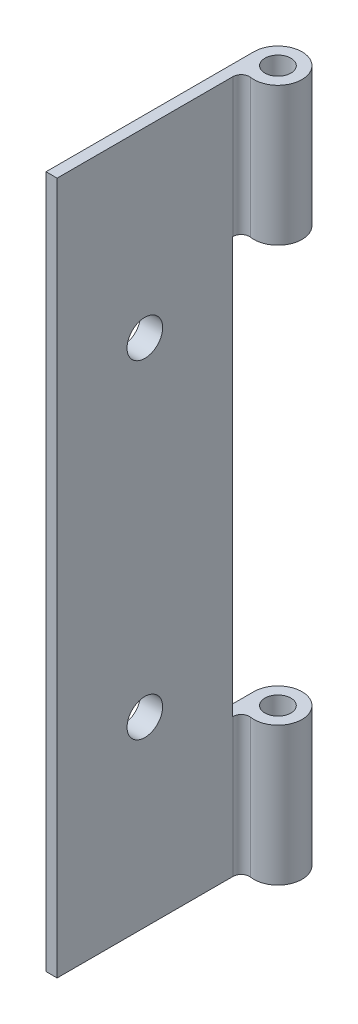
ISO-10303-21;
HEADER;
FILE_DESCRIPTION(('STEP AP214'),'2;1');
FILE_NAME('part.step','',(''),(''),'','','');
FILE_SCHEMA(('AUTOMOTIVE_DESIGN { 1 0 10303 214 1 1 1 1 }'));
ENDSEC;
DATA;
#1=APPLICATION_CONTEXT('core data for automotive mechanical design processes');
#2=APPLICATION_PROTOCOL_DEFINITION('international standard','automotive_design',2000,#1);
#3=PRODUCT_CONTEXT('',#1,'mechanical');
#4=PRODUCT('Part','Part','',(#3));
#5=PRODUCT_RELATED_PRODUCT_CATEGORY('part','',(#4));
#6=PRODUCT_DEFINITION_FORMATION('','',#4);
#7=PRODUCT_DEFINITION_CONTEXT('part definition',#1,'design');
#8=PRODUCT_DEFINITION('design','',#6,#7);
#9=PRODUCT_DEFINITION_SHAPE('','',#8);
#10=(LENGTH_UNIT() NAMED_UNIT(*) SI_UNIT(.MILLI.,.METRE.));
#11=(NAMED_UNIT(*) PLANE_ANGLE_UNIT() SI_UNIT($,.RADIAN.));
#12=(NAMED_UNIT(*) SI_UNIT($,.STERADIAN.) SOLID_ANGLE_UNIT());
#13=UNCERTAINTY_MEASURE_WITH_UNIT(LENGTH_MEASURE(1.E-05),#10,'distance_accuracy_value','');
#14=(GEOMETRIC_REPRESENTATION_CONTEXT(3) GLOBAL_UNCERTAINTY_ASSIGNED_CONTEXT((#13)) GLOBAL_UNIT_ASSIGNED_CONTEXT((#10,
#11,#12)) REPRESENTATION_CONTEXT('',''));
#15=CARTESIAN_POINT('',(0.,0.,0.));
#16=DIRECTION('',(0.,0.,1.));
#17=DIRECTION('',(1.,0.,0.));
#18=AXIS2_PLACEMENT_3D('',#15,#16,#17);
#19=CARTESIAN_POINT('',(-0.445,50.355,15.968625));
#20=DIRECTION('',(0.,0.,-1.));
#21=DIRECTION('',(0.,1.,0.));
#22=AXIS2_PLACEMENT_3D('',#19,#20,#21);
#23=CYLINDRICAL_SURFACE('',#22,0.444999999999999);
#24=CARTESIAN_POINT('',(-0.445,50.355,15.968625));
#25=DIRECTION('',(0.,0.,-1.));
#26=DIRECTION('',(0.,1.,0.));
#27=AXIS2_PLACEMENT_3D('',#24,#25,#26);
#28=CIRCLE('',#27,0.444999999999999);
#29=CARTESIAN_POINT('',(-0.445,50.8,15.968625));
#30=VERTEX_POINT('',#29);
#31=EDGE_CURVE('E11',#30,#30,#28,.T.);
#32=ORIENTED_EDGE('',*,*,#31,.T.);
#33=EDGE_LOOP('',(#32));
#34=FACE_BOUND('',#33,.T.);
#35=CARTESIAN_POINT('',(-0.445,50.355,2.968625));
#36=DIRECTION('',(0.,0.,-1.));
#37=DIRECTION('',(0.,1.,0.));
#38=AXIS2_PLACEMENT_3D('',#35,#36,#37);
#39=CIRCLE('',#38,0.444999999999999);
#40=CARTESIAN_POINT('',(-0.445,50.8,2.968625));
#41=VERTEX_POINT('',#40);
#42=EDGE_CURVE('E57',#41,#41,#39,.T.);
#43=ORIENTED_EDGE('',*,*,#42,.F.);
#44=EDGE_LOOP('',(#43));
#45=FACE_BOUND('',#44,.T.);
#46=ADVANCED_FACE('F54',(#34,#45),#23,.T.);
#47=CARTESIAN_POINT('',(-0.445,50.355,15.968625));
#48=DIRECTION('',(0.,0.,-1.));
#49=DIRECTION('',(0.,1.,0.));
#50=AXIS2_PLACEMENT_3D('',#47,#48,#49);
#51=PLANE('',#50);
#52=ORIENTED_EDGE('',*,*,#31,.F.);
#53=EDGE_LOOP('',(#52));
#54=FACE_BOUND('',#53,.T.);
#55=ADVANCED_FACE('F69',(#54),#51,.F.);
#56=CARTESIAN_POINT('',(-0.445,50.355,2.968625));
#57=DIRECTION('',(0.,0.,-1.));
#58=DIRECTION('',(0.,1.,0.));
#59=AXIS2_PLACEMENT_3D('',#56,#57,#58);
#60=PLANE('',#59);
#61=ORIENTED_EDGE('',*,*,#42,.T.);
#62=EDGE_LOOP('',(#61));
#63=FACE_BOUND('',#62,.T.);
#64=ADVANCED_FACE('F66',(#63),#60,.T.);
#65=CLOSED_SHELL('',(#46,#55,#64));
#66=MANIFOLD_SOLID_BREP('B2',#65);
#67=CARTESIAN_POINT('',(0.,88.9,0.));
#68=DIRECTION('',(1.,0.,0.));
#69=DIRECTION('',(0.,0.,-1.));
#70=AXIS2_PLACEMENT_3D('',#67,#68,#69);
#71=PLANE('',#70);
#72=DIRECTION('',(0.,-1.,0.));
#73=VECTOR('',#72,1.);
#74=CARTESIAN_POINT('',(0.,63.5,2.968625));
#75=LINE('',#74,#73);
#76=CARTESIAN_POINT('',(0.,63.5,2.968625));
#77=VERTEX_POINT('',#76);
#78=CARTESIAN_POINT('',(0.,25.4,2.968625));
#79=VERTEX_POINT('',#78);
#80=EDGE_CURVE('E387',#77,#79,#75,.T.);
#81=ORIENTED_EDGE('',*,*,#80,.T.);
#82=DIRECTION('',(0.,0.,-1.));
#83=VECTOR('',#82,1.);
#84=CARTESIAN_POINT('',(0.,25.4,2.968625));
#85=LINE('',#84,#83);
#86=CARTESIAN_POINT('',(0.,25.4,0.));
#87=VERTEX_POINT('',#86);
#88=EDGE_CURVE('E394',#79,#87,#85,.T.);
#89=ORIENTED_EDGE('',*,*,#88,.T.);
#90=DIRECTION('',(0.,-1.,0.));
#91=VECTOR('',#90,1.);
#92=CARTESIAN_POINT('',(0.,88.9,0.));
#93=LINE('',#92,#91);
#94=CARTESIAN_POINT('',(0.,12.7,0.));
#95=VERTEX_POINT('',#94);
#96=EDGE_CURVE('E324',#87,#95,#93,.T.);
#97=ORIENTED_EDGE('',*,*,#96,.T.);
#98=DIRECTION('',(0.,0.,1.));
#99=VECTOR('',#98,1.);
#100=CARTESIAN_POINT('',(0.,12.7,2.968625));
#101=LINE('',#100,#99);
#102=CARTESIAN_POINT('',(0.,12.7,19.05));
#103=VERTEX_POINT('',#102);
#104=EDGE_CURVE('E377',#95,#103,#101,.T.);
#105=ORIENTED_EDGE('',*,*,#104,.T.);
#106=DIRECTION('',(0.,-1.,0.));
#107=VECTOR('',#106,1.);
#108=CARTESIAN_POINT('',(0.,88.9,19.05));
#109=LINE('',#108,#107);
#110=CARTESIAN_POINT('',(0.,76.2,19.05));
#111=VERTEX_POINT('',#110);
#112=EDGE_CURVE('E328',#111,#103,#109,.T.);
#113=ORIENTED_EDGE('',*,*,#112,.F.);
#114=DIRECTION('',(0.,0.,-1.));
#115=VECTOR('',#114,1.);
#116=CARTESIAN_POINT('',(0.,76.2,2.968625));
#117=LINE('',#116,#115);
#118=CARTESIAN_POINT('',(0.,76.2,0.));
#119=VERTEX_POINT('',#118);
#120=EDGE_CURVE('E398',#111,#119,#117,.T.);
#121=ORIENTED_EDGE('',*,*,#120,.T.);
#122=CARTESIAN_POINT('',(0.,63.5,0.));
#123=VERTEX_POINT('',#122);
#124=EDGE_CURVE('E320',#119,#123,#93,.T.);
#125=ORIENTED_EDGE('',*,*,#124,.T.);
#126=DIRECTION('',(0.,0.,1.));
#127=VECTOR('',#126,1.);
#128=CARTESIAN_POINT('',(0.,63.5,2.968625));
#129=LINE('',#128,#127);
#130=EDGE_CURVE('E383',#123,#77,#129,.T.);
#131=ORIENTED_EDGE('',*,*,#130,.T.);
#132=EDGE_LOOP('',(#81,#89,#97,#105,#113,#121,#125,#131));
#133=FACE_BOUND('',#132,.T.);
#134=DIRECTION('',(0.,-1.,0.));
#135=VECTOR('',#134,1.);
#136=CARTESIAN_POINT('',(0.,63.5,6.008625));
#137=LINE('',#136,#135);
#138=CARTESIAN_POINT('',(0.,54.5,6.008625));
#139=VERTEX_POINT('',#138);
#140=CARTESIAN_POINT('',(0.,64.5,6.008625));
#141=VERTEX_POINT('',#140);
#142=EDGE_CURVE('E246',#139,#141,#137,.F.);
#143=ORIENTED_EDGE('',*,*,#142,.T.);
#144=DIRECTION('',(0.,0.,-1.));
#145=VECTOR('',#144,1.);
#146=CARTESIAN_POINT('',(0.,64.5,15.008625));
#147=LINE('',#146,#145);
#148=CARTESIAN_POINT('',(0.,64.5,16.008625));
#149=VERTEX_POINT('',#148);
#150=EDGE_CURVE('E278',#141,#149,#147,.F.);
#151=ORIENTED_EDGE('',*,*,#150,.T.);
#152=DIRECTION('',(0.,1.,0.));
#153=VECTOR('',#152,1.);
#154=CARTESIAN_POINT('',(0.,55.5,16.008625));
#155=LINE('',#154,#153);
#156=CARTESIAN_POINT('',(0.,54.5,16.008625));
#157=VERTEX_POINT('',#156);
#158=EDGE_CURVE('E301',#149,#157,#155,.F.);
#159=ORIENTED_EDGE('',*,*,#158,.T.);
#160=DIRECTION('',(0.,0.,1.));
#161=VECTOR('',#160,1.);
#162=CARTESIAN_POINT('',(0.,54.5,7.008625));
#163=LINE('',#162,#161);
#164=EDGE_CURVE('E298',#157,#139,#163,.F.);
#165=ORIENTED_EDGE('',*,*,#164,.T.);
#166=EDGE_LOOP('',(#143,#151,#159,#165));
#167=FACE_BOUND('',#166,.T.);
#168=DIRECTION('',(0.,1.,0.));
#169=VECTOR('',#168,1.);
#170=CARTESIAN_POINT('',(0.,25.4,16.008625));
#171=LINE('',#170,#169);
#172=CARTESIAN_POINT('',(0.,34.4,16.008625));
#173=VERTEX_POINT('',#172);
#174=CARTESIAN_POINT('',(0.,24.4,16.008625));
#175=VERTEX_POINT('',#174);
#176=EDGE_CURVE('E308',#173,#175,#171,.F.);
#177=ORIENTED_EDGE('',*,*,#176,.T.);
#178=DIRECTION('',(0.,0.,1.));
#179=VECTOR('',#178,1.);
#180=CARTESIAN_POINT('',(0.,24.4,7.008625));
#181=LINE('',#180,#179);
#182=CARTESIAN_POINT('',(0.,24.4,6.008625));
#183=VERTEX_POINT('',#182);
#184=EDGE_CURVE('E304',#175,#183,#181,.F.);
#185=ORIENTED_EDGE('',*,*,#184,.T.);
#186=DIRECTION('',(0.,-1.,0.));
#187=VECTOR('',#186,1.);
#188=CARTESIAN_POINT('',(0.,33.4,6.008625));
#189=LINE('',#188,#187);
#190=CARTESIAN_POINT('',(0.,34.4,6.008625));
#191=VERTEX_POINT('',#190);
#192=EDGE_CURVE('E314',#183,#191,#189,.F.);
#193=ORIENTED_EDGE('',*,*,#192,.T.);
#194=DIRECTION('',(0.,0.,-1.));
#195=VECTOR('',#194,1.);
#196=CARTESIAN_POINT('',(0.,34.4,15.008625));
#197=LINE('',#196,#195);
#198=EDGE_CURVE('E311',#191,#173,#197,.F.);
#199=ORIENTED_EDGE('',*,*,#198,.T.);
#200=EDGE_LOOP('',(#177,#185,#193,#199));
#201=FACE_BOUND('',#200,.T.);
#202=ADVANCED_FACE('F95',(#133,#167,#201),#71,.F.);
#203=CARTESIAN_POINT('',(1.016,88.9,19.05));
#204=DIRECTION('',(-1.,0.,0.));
#205=DIRECTION('',(0.,0.,1.));
#206=AXIS2_PLACEMENT_3D('',#203,#204,#205);
#207=PLANE('',#206);
#208=CARTESIAN_POINT('',(1.016,29.4,11.008625));
#209=DIRECTION('',(-1.,0.,0.));
#210=DIRECTION('',(0.,0.,1.));
#211=AXIS2_PLACEMENT_3D('',#208,#209,#210);
#212=CIRCLE('',#211,1.63);
#213=CARTESIAN_POINT('',(1.016,29.4,12.638625));
#214=VERTEX_POINT('',#213);
#215=EDGE_CURVE('E262',#214,#214,#212,.T.);
#216=ORIENTED_EDGE('',*,*,#215,.T.);
#217=EDGE_LOOP('',(#216));
#218=FACE_BOUND('',#217,.T.);
#219=CARTESIAN_POINT('',(1.016,59.5,11.008625));
#220=DIRECTION('',(-1.,0.,0.));
#221=DIRECTION('',(0.,0.,1.));
#222=AXIS2_PLACEMENT_3D('',#219,#220,#221);
#223=CIRCLE('',#222,1.63);
#224=CARTESIAN_POINT('',(1.016,59.5,12.638625));
#225=VERTEX_POINT('',#224);
#226=EDGE_CURVE('E599',#225,#225,#223,.T.);
#227=ORIENTED_EDGE('',*,*,#226,.T.);
#228=EDGE_LOOP('',(#227));
#229=FACE_BOUND('',#228,.T.);
#230=DIRECTION('',(0.,0.,1.));
#231=VECTOR('',#230,1.);
#232=CARTESIAN_POINT('',(1.016,63.5,19.05));
#233=LINE('',#232,#231);
#234=CARTESIAN_POINT('',(1.016,63.5,2.9236075318004));
#235=VERTEX_POINT('',#234);
#236=CARTESIAN_POINT('',(1.016,63.5,2.968625));
#237=VERTEX_POINT('',#236);
#238=EDGE_CURVE('E349',#235,#237,#233,.T.);
#239=ORIENTED_EDGE('',*,*,#238,.F.);
#240=DIRECTION('',(0.,1.,0.));
#241=VECTOR('',#240,1.);
#242=CARTESIAN_POINT('',(1.016,76.2,2.9236075318004));
#243=LINE('',#242,#241);
#244=CARTESIAN_POINT('',(1.016,76.2,2.9236075318004));
#245=VERTEX_POINT('',#244);
#246=EDGE_CURVE('E277',#235,#245,#243,.T.);
#247=ORIENTED_EDGE('',*,*,#246,.T.);
#248=DIRECTION('',(0.,0.,-1.));
#249=VECTOR('',#248,1.);
#250=CARTESIAN_POINT('',(1.016,76.2,19.05));
#251=LINE('',#250,#249);
#252=CARTESIAN_POINT('',(1.016,76.2,19.05));
#253=VERTEX_POINT('',#252);
#254=EDGE_CURVE('E369',#253,#245,#251,.T.);
#255=ORIENTED_EDGE('',*,*,#254,.F.);
#256=DIRECTION('',(0.,-1.,0.));
#257=VECTOR('',#256,1.);
#258=CARTESIAN_POINT('',(1.016,88.9,19.05));
#259=LINE('',#258,#257);
#260=CARTESIAN_POINT('',(1.016,12.7,19.05));
#261=VERTEX_POINT('',#260);
#262=EDGE_CURVE('E331',#253,#261,#259,.T.);
#263=ORIENTED_EDGE('',*,*,#262,.T.);
#264=DIRECTION('',(0.,0.,1.));
#265=VECTOR('',#264,1.);
#266=CARTESIAN_POINT('',(1.016,12.7,19.05));
#267=LINE('',#266,#265);
#268=CARTESIAN_POINT('',(1.016,12.7,2.9236075318004));
#269=VERTEX_POINT('',#268);
#270=EDGE_CURVE('E338',#269,#261,#267,.T.);
#271=ORIENTED_EDGE('',*,*,#270,.F.);
#272=DIRECTION('',(0.,1.,0.));
#273=VECTOR('',#272,1.);
#274=CARTESIAN_POINT('',(1.016,25.4,2.9236075318004));
#275=LINE('',#274,#273);
#276=CARTESIAN_POINT('',(1.016,25.4,2.9236075318004));
#277=VERTEX_POINT('',#276);
#278=EDGE_CURVE('E273',#269,#277,#275,.T.);
#279=ORIENTED_EDGE('',*,*,#278,.T.);
#280=DIRECTION('',(0.,0.,-1.));
#281=VECTOR('',#280,1.);
#282=CARTESIAN_POINT('',(1.016,25.4,19.05));
#283=LINE('',#282,#281);
#284=CARTESIAN_POINT('',(1.016,25.4,2.968625));
#285=VERTEX_POINT('',#284);
#286=EDGE_CURVE('E359',#285,#277,#283,.T.);
#287=ORIENTED_EDGE('',*,*,#286,.F.);
#288=DIRECTION('',(0.,-1.,0.));
#289=VECTOR('',#288,1.);
#290=CARTESIAN_POINT('',(1.016,88.9,2.968625));
#291=LINE('',#290,#289);
#292=EDGE_CURVE('E317',#237,#285,#291,.T.);
#293=ORIENTED_EDGE('',*,*,#292,.F.);
#294=EDGE_LOOP('',(#239,#247,#255,#263,#271,#279,#287,#293));
#295=FACE_BOUND('',#294,.T.);
#296=ADVANCED_FACE('F447',(#218,#229,#295),#207,.F.);
#297=CARTESIAN_POINT('',(2.206625,88.9,0.));
#298=DIRECTION('',(0.,-1.,0.));
#299=DIRECTION('',(0.,0.,-1.));
#300=AXIS2_PLACEMENT_3D('',#297,#298,#299);
#301=CYLINDRICAL_SURFACE('',#300,2.206625);
#302=CARTESIAN_POINT('',(2.206625,25.4,0.));
#303=DIRECTION('',(0.,1.,0.));
#304=DIRECTION('',(0.,0.,1.));
#305=AXIS2_PLACEMENT_3D('',#302,#303,#304);
#306=CIRCLE('',#305,2.206625);
#307=CARTESIAN_POINT('',(1.87777229104131,25.4,2.18198299407569));
#308=VERTEX_POINT('',#307);
#309=EDGE_CURVE('E356',#308,#87,#306,.T.);
#310=ORIENTED_EDGE('',*,*,#309,.F.);
#311=DIRECTION('',(0.,-1.,0.));
#312=VECTOR('',#311,1.);
#313=CARTESIAN_POINT('',(1.87777229104131,88.9,2.18198299407569));
#314=LINE('',#313,#312);
#315=CARTESIAN_POINT('',(1.87777229104131,12.7,2.18198299407569));
#316=VERTEX_POINT('',#315);
#317=EDGE_CURVE('E111',#308,#316,#314,.T.);
#318=ORIENTED_EDGE('',*,*,#317,.T.);
#319=CARTESIAN_POINT('',(2.206625,12.7,0.));
#320=DIRECTION('',(0.,-1.,0.));
#321=DIRECTION('',(0.,0.,-1.));
#322=AXIS2_PLACEMENT_3D('',#319,#320,#321);
#323=CIRCLE('',#322,2.206625);
#324=EDGE_CURVE('E335',#95,#316,#323,.T.);
#325=ORIENTED_EDGE('',*,*,#324,.F.);
#326=ORIENTED_EDGE('',*,*,#96,.F.);
#327=EDGE_LOOP('',(#310,#318,#325,#326));
#328=FACE_BOUND('',#327,.T.);
#329=ADVANCED_FACE('F455',(#328),#301,.T.);
#330=CARTESIAN_POINT('',(2.206625,76.2,0.));
#331=DIRECTION('',(0.,1.,0.));
#332=DIRECTION('',(0.,0.,1.));
#333=AXIS2_PLACEMENT_3D('',#330,#331,#332);
#334=CIRCLE('',#333,2.206625);
#335=CARTESIAN_POINT('',(1.87777229104131,76.2,2.18198299407569));
#336=VERTEX_POINT('',#335);
#337=EDGE_CURVE('E366',#336,#119,#334,.T.);
#338=ORIENTED_EDGE('',*,*,#337,.F.);
#339=DIRECTION('',(0.,-1.,0.));
#340=VECTOR('',#339,1.);
#341=CARTESIAN_POINT('',(1.87777229104131,88.9,2.18198299407569));
#342=LINE('',#341,#340);
#343=CARTESIAN_POINT('',(1.87777229104131,63.5,2.18198299407569));
#344=VERTEX_POINT('',#343);
#345=EDGE_CURVE('E282',#336,#344,#342,.T.);
#346=ORIENTED_EDGE('',*,*,#345,.T.);
#347=CARTESIAN_POINT('',(2.206625,63.5,0.));
#348=DIRECTION('',(0.,-1.,0.));
#349=DIRECTION('',(0.,0.,-1.));
#350=AXIS2_PLACEMENT_3D('',#347,#348,#349);
#351=CIRCLE('',#350,2.206625);
#352=EDGE_CURVE('E345',#123,#344,#351,.T.);
#353=ORIENTED_EDGE('',*,*,#352,.F.);
#354=ORIENTED_EDGE('',*,*,#124,.F.);
#355=EDGE_LOOP('',(#338,#346,#353,#354));
#356=FACE_BOUND('',#355,.T.);
#357=ADVANCED_FACE('F463',(#356),#301,.T.);
#358=CARTESIAN_POINT('',(2.206625,88.9,0.));
#359=DIRECTION('',(0.,-1.,0.));
#360=DIRECTION('',(0.,0.,-1.));
#361=AXIS2_PLACEMENT_3D('',#358,#359,#360);
#362=CYLINDRICAL_SURFACE('',#361,1.190625);
#363=CARTESIAN_POINT('',(2.206625,12.7,0.));
#364=DIRECTION('',(0.,-1.,0.));
#365=DIRECTION('',(0.,0.,-1.));
#366=AXIS2_PLACEMENT_3D('',#363,#364,#365);
#367=CIRCLE('',#366,1.190625);
#368=CARTESIAN_POINT('',(2.206625,12.7,-1.190625));
#369=VERTEX_POINT('',#368);
#370=EDGE_CURVE('E341',#369,#369,#367,.F.);
#371=ORIENTED_EDGE('',*,*,#370,.F.);
#372=EDGE_LOOP('',(#371));
#373=FACE_BOUND('',#372,.T.);
#374=CARTESIAN_POINT('',(2.206625,25.4,0.));
#375=DIRECTION('',(0.,1.,0.));
#376=DIRECTION('',(0.,0.,1.));
#377=AXIS2_PLACEMENT_3D('',#374,#375,#376);
#378=CIRCLE('',#377,1.190625);
#379=CARTESIAN_POINT('',(2.206625,25.4,1.190625));
#380=VERTEX_POINT('',#379);
#381=EDGE_CURVE('E362',#380,#380,#378,.F.);
#382=ORIENTED_EDGE('',*,*,#381,.F.);
#383=EDGE_LOOP('',(#382));
#384=FACE_BOUND('',#383,.T.);
#385=ADVANCED_FACE('F539',(#373,#384),#362,.F.);
#386=CARTESIAN_POINT('',(2.206625,63.5,0.));
#387=DIRECTION('',(0.,-1.,0.));
#388=DIRECTION('',(0.,0.,-1.));
#389=AXIS2_PLACEMENT_3D('',#386,#387,#388);
#390=CIRCLE('',#389,1.190625);
#391=CARTESIAN_POINT('',(2.206625,63.5,-1.190625));
#392=VERTEX_POINT('',#391);
#393=EDGE_CURVE('E352',#392,#392,#390,.F.);
#394=ORIENTED_EDGE('',*,*,#393,.F.);
#395=EDGE_LOOP('',(#394));
#396=FACE_BOUND('',#395,.T.);
#397=CARTESIAN_POINT('',(2.206625,76.2,0.));
#398=DIRECTION('',(0.,1.,0.));
#399=DIRECTION('',(0.,0.,1.));
#400=AXIS2_PLACEMENT_3D('',#397,#398,#399);
#401=CIRCLE('',#400,1.190625);
#402=CARTESIAN_POINT('',(2.206625,76.2,1.190625));
#403=VERTEX_POINT('',#402);
#404=EDGE_CURVE('E373',#403,#403,#401,.F.);
#405=ORIENTED_EDGE('',*,*,#404,.F.);
#406=EDGE_LOOP('',(#405));
#407=FACE_BOUND('',#406,.T.);
#408=ADVANCED_FACE('F540',(#396,#407),#362,.F.);
#409=CARTESIAN_POINT('',(0.,88.9,19.05));
#410=DIRECTION('',(0.,0.,-1.));
#411=DIRECTION('',(-1.,0.,0.));
#412=AXIS2_PLACEMENT_3D('',#409,#410,#411);
#413=PLANE('',#412);
#414=ORIENTED_EDGE('',*,*,#262,.F.);
#415=DIRECTION('',(-1.,0.,0.));
#416=VECTOR('',#415,1.);
#417=CARTESIAN_POINT('',(4.41425,76.2,19.05));
#418=LINE('',#417,#416);
#419=EDGE_CURVE('E402',#253,#111,#418,.T.);
#420=ORIENTED_EDGE('',*,*,#419,.T.);
#421=ORIENTED_EDGE('',*,*,#112,.T.);
#422=DIRECTION('',(-1.,0.,0.));
#423=VECTOR('',#422,1.);
#424=CARTESIAN_POINT('',(4.41425,12.7,19.05));
#425=LINE('',#424,#423);
#426=EDGE_CURVE('E406',#261,#103,#425,.T.);
#427=ORIENTED_EDGE('',*,*,#426,.F.);
#428=EDGE_LOOP('',(#414,#420,#421,#427));
#429=FACE_BOUND('',#428,.T.);
#430=ADVANCED_FACE('F460',(#429),#413,.F.);
#431=CARTESIAN_POINT('',(4.41325,12.7,2.968625));
#432=DIRECTION('',(0.,-1.,0.));
#433=DIRECTION('',(0.,0.,-1.));
#434=AXIS2_PLACEMENT_3D('',#431,#432,#433);
#435=PLANE('',#434);
#436=ORIENTED_EDGE('',*,*,#324,.T.);
#437=CARTESIAN_POINT('',(1.766,12.7,2.9236075318004));
#438=DIRECTION('',(0.,-1.,0.));
#439=DIRECTION('',(0.,0.,-1.));
#440=AXIS2_PLACEMENT_3D('',#437,#438,#439);
#441=CIRCLE('',#440,0.75);
#442=EDGE_CURVE('E52',#316,#269,#441,.F.);
#443=ORIENTED_EDGE('',*,*,#442,.T.);
#444=ORIENTED_EDGE('',*,*,#270,.T.);
#445=ORIENTED_EDGE('',*,*,#426,.T.);
#446=ORIENTED_EDGE('',*,*,#104,.F.);
#447=EDGE_LOOP('',(#436,#443,#444,#445,#446));
#448=FACE_BOUND('',#447,.T.);
#449=ORIENTED_EDGE('',*,*,#370,.T.);
#450=EDGE_LOOP('',(#449));
#451=FACE_BOUND('',#450,.T.);
#452=ADVANCED_FACE('F522',(#448,#451),#435,.T.);
#453=CARTESIAN_POINT('',(4.41325,76.2,2.968625));
#454=DIRECTION('',(0.,1.,0.));
#455=DIRECTION('',(0.,0.,1.));
#456=AXIS2_PLACEMENT_3D('',#453,#454,#455);
#457=PLANE('',#456);
#458=ORIENTED_EDGE('',*,*,#404,.T.);
#459=EDGE_LOOP('',(#458));
#460=FACE_BOUND('',#459,.T.);
#461=ORIENTED_EDGE('',*,*,#254,.T.);
#462=CARTESIAN_POINT('',(1.766,76.2,2.9236075318004));
#463=DIRECTION('',(0.,1.,0.));
#464=DIRECTION('',(0.,0.,1.));
#465=AXIS2_PLACEMENT_3D('',#462,#463,#464);
#466=CIRCLE('',#465,0.75);
#467=EDGE_CURVE('E287',#245,#336,#466,.F.);
#468=ORIENTED_EDGE('',*,*,#467,.T.);
#469=ORIENTED_EDGE('',*,*,#337,.T.);
#470=ORIENTED_EDGE('',*,*,#120,.F.);
#471=ORIENTED_EDGE('',*,*,#419,.F.);
#472=EDGE_LOOP('',(#461,#468,#469,#470,#471));
#473=FACE_BOUND('',#472,.T.);
#474=ADVANCED_FACE('F514',(#460,#473),#457,.T.);
#475=CARTESIAN_POINT('',(4.41325,25.4,2.968625));
#476=DIRECTION('',(0.,1.,0.));
#477=DIRECTION('',(0.,0.,1.));
#478=AXIS2_PLACEMENT_3D('',#475,#476,#477);
#479=PLANE('',#478);
#480=ORIENTED_EDGE('',*,*,#381,.T.);
#481=EDGE_LOOP('',(#480));
#482=FACE_BOUND('',#481,.T.);
#483=ORIENTED_EDGE('',*,*,#286,.T.);
#484=CARTESIAN_POINT('',(1.766,25.4,2.9236075318004));
#485=DIRECTION('',(0.,1.,0.));
#486=DIRECTION('',(0.,0.,1.));
#487=AXIS2_PLACEMENT_3D('',#484,#485,#486);
#488=CIRCLE('',#487,0.75);
#489=EDGE_CURVE('E104',#277,#308,#488,.F.);
#490=ORIENTED_EDGE('',*,*,#489,.T.);
#491=ORIENTED_EDGE('',*,*,#309,.T.);
#492=ORIENTED_EDGE('',*,*,#88,.F.);
#493=DIRECTION('',(-1.,0.,0.));
#494=VECTOR('',#493,1.);
#495=CARTESIAN_POINT('',(4.41325,25.4,2.968625));
#496=LINE('',#495,#494);
#497=EDGE_CURVE('E390',#285,#79,#496,.T.);
#498=ORIENTED_EDGE('',*,*,#497,.F.);
#499=EDGE_LOOP('',(#483,#490,#491,#492,#498));
#500=FACE_BOUND('',#499,.T.);
#501=ADVANCED_FACE('F526',(#482,#500),#479,.T.);
#502=CARTESIAN_POINT('',(4.41325,63.5,2.968625));
#503=DIRECTION('',(0.,0.,-1.));
#504=DIRECTION('',(0.,1.,0.));
#505=AXIS2_PLACEMENT_3D('',#502,#503,#504);
#506=PLANE('',#505);
#507=DIRECTION('',(-1.,0.,0.));
#508=VECTOR('',#507,1.);
#509=CARTESIAN_POINT('',(4.41325,63.5,2.968625));
#510=LINE('',#509,#508);
#511=EDGE_CURVE('E380',#237,#77,#510,.T.);
#512=ORIENTED_EDGE('',*,*,#511,.F.);
#513=ORIENTED_EDGE('',*,*,#292,.T.);
#514=ORIENTED_EDGE('',*,*,#497,.T.);
#515=ORIENTED_EDGE('',*,*,#80,.F.);
#516=EDGE_LOOP('',(#512,#513,#514,#515));
#517=FACE_BOUND('',#516,.T.);
#518=ADVANCED_FACE('F507',(#517),#506,.T.);
#519=CARTESIAN_POINT('',(4.41325,63.5,2.968625));
#520=DIRECTION('',(0.,-1.,0.));
#521=DIRECTION('',(0.,0.,-1.));
#522=AXIS2_PLACEMENT_3D('',#519,#520,#521);
#523=PLANE('',#522);
#524=ORIENTED_EDGE('',*,*,#352,.T.);
#525=CARTESIAN_POINT('',(1.766,63.5,2.9236075318004));
#526=DIRECTION('',(0.,-1.,0.));
#527=DIRECTION('',(0.,0.,-1.));
#528=AXIS2_PLACEMENT_3D('',#525,#526,#527);
#529=CIRCLE('',#528,0.75);
#530=EDGE_CURVE('E290',#344,#235,#529,.F.);
#531=ORIENTED_EDGE('',*,*,#530,.T.);
#532=ORIENTED_EDGE('',*,*,#238,.T.);
#533=ORIENTED_EDGE('',*,*,#511,.T.);
#534=ORIENTED_EDGE('',*,*,#130,.F.);
#535=EDGE_LOOP('',(#524,#531,#532,#533,#534));
#536=FACE_BOUND('',#535,.T.);
#537=ORIENTED_EDGE('',*,*,#393,.T.);
#538=EDGE_LOOP('',(#537));
#539=FACE_BOUND('',#538,.T.);
#540=ADVANCED_FACE('F497',(#536,#539),#523,.T.);
#541=CARTESIAN_POINT('',(-1.,0.,0.));
#542=DIRECTION('',(1.,0.,0.));
#543=DIRECTION('',(0.,0.,-1.));
#544=AXIS2_PLACEMENT_3D('',#541,#542,#543);
#545=PLANE('',#544);
#546=CARTESIAN_POINT('',(-1.,29.4,11.008625));
#547=DIRECTION('',(-1.,0.,0.));
#548=DIRECTION('',(0.,0.,1.));
#549=AXIS2_PLACEMENT_3D('',#546,#547,#548);
#550=CIRCLE('',#549,1.63);
#551=CARTESIAN_POINT('',(-1.,29.4,12.638625));
#552=VERTEX_POINT('',#551);
#553=EDGE_CURVE('E569',#552,#552,#550,.T.);
#554=ORIENTED_EDGE('',*,*,#553,.F.);
#555=EDGE_LOOP('',(#554));
#556=FACE_BOUND('',#555,.T.);
#557=DIRECTION('',(0.,-1.,0.));
#558=VECTOR('',#557,1.);
#559=CARTESIAN_POINT('',(-1.,25.4,7.008625));
#560=LINE('',#559,#558);
#561=CARTESIAN_POINT('',(-1.,33.4,7.008625));
#562=VERTEX_POINT('',#561);
#563=CARTESIAN_POINT('',(-1.,25.4,7.008625));
#564=VERTEX_POINT('',#563);
#565=EDGE_CURVE('E231',#562,#564,#560,.T.);
#566=ORIENTED_EDGE('',*,*,#565,.T.);
#567=DIRECTION('',(0.,0.,1.));
#568=VECTOR('',#567,1.);
#569=CARTESIAN_POINT('',(-1.,25.4,7.008625));
#570=LINE('',#569,#568);
#571=CARTESIAN_POINT('',(-1.,25.4,15.008625));
#572=VERTEX_POINT('',#571);
#573=EDGE_CURVE('E416',#564,#572,#570,.T.);
#574=ORIENTED_EDGE('',*,*,#573,.T.);
#575=DIRECTION('',(0.,1.,0.));
#576=VECTOR('',#575,1.);
#577=CARTESIAN_POINT('',(-1.,25.4,15.008625));
#578=LINE('',#577,#576);
#579=CARTESIAN_POINT('',(-1.,33.4,15.008625));
#580=VERTEX_POINT('',#579);
#581=EDGE_CURVE('E420',#572,#580,#578,.T.);
#582=ORIENTED_EDGE('',*,*,#581,.T.);
#583=DIRECTION('',(0.,0.,-1.));
#584=VECTOR('',#583,1.);
#585=CARTESIAN_POINT('',(-1.,33.4,7.008625));
#586=LINE('',#585,#584);
#587=EDGE_CURVE('E252',#580,#562,#586,.T.);
#588=ORIENTED_EDGE('',*,*,#587,.T.);
#589=EDGE_LOOP('',(#566,#574,#582,#588));
#590=FACE_BOUND('',#589,.T.);
#591=ADVANCED_FACE('F556',(#556,#590),#545,.F.);
#592=CARTESIAN_POINT('',(-1.,0.,0.));
#593=DIRECTION('',(-1.,0.,0.));
#594=DIRECTION('',(0.,0.,1.));
#595=AXIS2_PLACEMENT_3D('',#592,#593,#594);
#596=PLANE('',#595);
#597=CARTESIAN_POINT('',(-1.,59.5,11.008625));
#598=DIRECTION('',(-1.,0.,0.));
#599=DIRECTION('',(0.,0.,1.));
#600=AXIS2_PLACEMENT_3D('',#597,#598,#599);
#601=CIRCLE('',#600,1.63);
#602=CARTESIAN_POINT('',(-1.,59.5,12.638625));
#603=VERTEX_POINT('',#602);
#604=EDGE_CURVE('E596',#603,#603,#601,.T.);
#605=ORIENTED_EDGE('',*,*,#604,.F.);
#606=EDGE_LOOP('',(#605));
#607=FACE_BOUND('',#606,.T.);
#608=DIRECTION('',(0.,-1.,0.));
#609=VECTOR('',#608,1.);
#610=CARTESIAN_POINT('',(-1.,63.5,7.008625));
#611=LINE('',#610,#609);
#612=CARTESIAN_POINT('',(-1.,63.5,7.008625));
#613=VERTEX_POINT('',#612);
#614=CARTESIAN_POINT('',(-1.,55.5,7.008625));
#615=VERTEX_POINT('',#614);
#616=EDGE_CURVE('E220',#613,#615,#611,.T.);
#617=ORIENTED_EDGE('',*,*,#616,.T.);
#618=DIRECTION('',(0.,0.,1.));
#619=VECTOR('',#618,1.);
#620=CARTESIAN_POINT('',(-1.,55.5,7.008625));
#621=LINE('',#620,#619);
#622=CARTESIAN_POINT('',(-1.,55.5,15.008625));
#623=VERTEX_POINT('',#622);
#624=EDGE_CURVE('E223',#615,#623,#621,.T.);
#625=ORIENTED_EDGE('',*,*,#624,.T.);
#626=DIRECTION('',(0.,1.,0.));
#627=VECTOR('',#626,1.);
#628=CARTESIAN_POINT('',(-1.,63.5,15.008625));
#629=LINE('',#628,#627);
#630=CARTESIAN_POINT('',(-1.,63.5,15.008625));
#631=VERTEX_POINT('',#630);
#632=EDGE_CURVE('E243',#623,#631,#629,.T.);
#633=ORIENTED_EDGE('',*,*,#632,.T.);
#634=DIRECTION('',(0.,0.,-1.));
#635=VECTOR('',#634,1.);
#636=CARTESIAN_POINT('',(-1.,63.5,7.008625));
#637=LINE('',#636,#635);
#638=EDGE_CURVE('E226',#631,#613,#637,.T.);
#639=ORIENTED_EDGE('',*,*,#638,.T.);
#640=EDGE_LOOP('',(#617,#625,#633,#639));
#641=FACE_BOUND('',#640,.T.);
#642=ADVANCED_FACE('F222',(#607,#641),#596,.T.);
#643=CARTESIAN_POINT('',(-1.,54.5,7.008625));
#644=DIRECTION('',(0.,0.,-1.));
#645=DIRECTION('',(-1.,0.,0.));
#646=AXIS2_PLACEMENT_3D('',#643,#644,#645);
#647=CYLINDRICAL_SURFACE('',#646,1.);
#648=CARTESIAN_POINT('',(-1.,54.5,6.008625));
#649=DIRECTION('',(0.,0.707106781186547,-0.707106781186547));
#650=DIRECTION('',(0.,-0.707106781186548,-0.707106781186547));
#651=AXIS2_PLACEMENT_3D('',#648,#649,#650);
#652=ELLIPSE('',#651,1.41421356237309,1.);
#653=EDGE_CURVE('E237',#139,#615,#652,.F.);
#654=ORIENTED_EDGE('',*,*,#653,.F.);
#655=ORIENTED_EDGE('',*,*,#164,.F.);
#656=CARTESIAN_POINT('',(-1.,54.5,16.008625));
#657=DIRECTION('',(0.,-0.707106781186547,-0.707106781186547));
#658=DIRECTION('',(0.,-0.707106781186547,0.707106781186547));
#659=AXIS2_PLACEMENT_3D('',#656,#657,#658);
#660=ELLIPSE('',#659,1.41421356237309,1.);
#661=EDGE_CURVE('E240',#623,#157,#660,.T.);
#662=ORIENTED_EDGE('',*,*,#661,.F.);
#663=ORIENTED_EDGE('',*,*,#624,.F.);
#664=EDGE_LOOP('',(#654,#655,#662,#663));
#665=FACE_BOUND('',#664,.T.);
#666=ADVANCED_FACE('F235',(#665),#647,.F.);
#667=CARTESIAN_POINT('',(-1.,63.5,16.008625));
#668=DIRECTION('',(0.,-1.,0.));
#669=DIRECTION('',(0.,0.,-1.));
#670=AXIS2_PLACEMENT_3D('',#667,#668,#669);
#671=CYLINDRICAL_SURFACE('',#670,1.);
#672=ORIENTED_EDGE('',*,*,#661,.T.);
#673=ORIENTED_EDGE('',*,*,#158,.F.);
#674=CARTESIAN_POINT('',(-1.,64.5,16.008625));
#675=DIRECTION('',(0.,-0.707106781186547,0.707106781186547));
#676=DIRECTION('',(0.,-0.707106781186547,-0.707106781186547));
#677=AXIS2_PLACEMENT_3D('',#674,#675,#676);
#678=ELLIPSE('',#677,1.41421356237309,1.);
#679=EDGE_CURVE('E248',#631,#149,#678,.T.);
#680=ORIENTED_EDGE('',*,*,#679,.F.);
#681=ORIENTED_EDGE('',*,*,#632,.F.);
#682=EDGE_LOOP('',(#672,#673,#680,#681));
#683=FACE_BOUND('',#682,.T.);
#684=ADVANCED_FACE('F437',(#683),#671,.F.);
#685=CARTESIAN_POINT('',(-1.,63.5,6.008625));
#686=DIRECTION('',(0.,1.,0.));
#687=DIRECTION('',(0.,0.,1.));
#688=AXIS2_PLACEMENT_3D('',#685,#686,#687);
#689=CYLINDRICAL_SURFACE('',#688,1.);
#690=ORIENTED_EDGE('',*,*,#653,.T.);
#691=ORIENTED_EDGE('',*,*,#616,.F.);
#692=CARTESIAN_POINT('',(-1.,64.5,6.008625));
#693=DIRECTION('',(0.,0.707106781186548,0.707106781186547));
#694=DIRECTION('',(0.,0.707106781186547,-0.707106781186547));
#695=AXIS2_PLACEMENT_3D('',#692,#693,#694);
#696=ELLIPSE('',#695,1.4142135623731,1.);
#697=EDGE_CURVE('E254',#141,#613,#696,.F.);
#698=ORIENTED_EDGE('',*,*,#697,.F.);
#699=ORIENTED_EDGE('',*,*,#142,.F.);
#700=EDGE_LOOP('',(#690,#691,#698,#699));
#701=FACE_BOUND('',#700,.T.);
#702=ADVANCED_FACE('F245',(#701),#689,.F.);
#703=CARTESIAN_POINT('',(-1.,64.5,7.008625));
#704=DIRECTION('',(0.,0.,1.));
#705=DIRECTION('',(1.,0.,0.));
#706=AXIS2_PLACEMENT_3D('',#703,#704,#705);
#707=CYLINDRICAL_SURFACE('',#706,1.);
#708=ORIENTED_EDGE('',*,*,#679,.T.);
#709=ORIENTED_EDGE('',*,*,#150,.F.);
#710=ORIENTED_EDGE('',*,*,#697,.T.);
#711=ORIENTED_EDGE('',*,*,#638,.F.);
#712=EDGE_LOOP('',(#708,#709,#710,#711));
#713=FACE_BOUND('',#712,.T.);
#714=ADVANCED_FACE('F431',(#713),#707,.F.);
#715=CARTESIAN_POINT('',(-1.,34.4,7.008625));
#716=DIRECTION('',(0.,0.,1.));
#717=DIRECTION('',(1.,0.,0.));
#718=AXIS2_PLACEMENT_3D('',#715,#716,#717);
#719=CYLINDRICAL_SURFACE('',#718,1.);
#720=CARTESIAN_POINT('',(-1.,34.4,16.008625));
#721=DIRECTION('',(0.,-0.707106781186547,0.707106781186547));
#722=DIRECTION('',(0.,0.707106781186547,0.707106781186547));
#723=AXIS2_PLACEMENT_3D('',#720,#721,#722);
#724=ELLIPSE('',#723,1.41421356237309,1.);
#725=EDGE_CURVE('E265',#173,#580,#724,.F.);
#726=ORIENTED_EDGE('',*,*,#725,.F.);
#727=ORIENTED_EDGE('',*,*,#198,.F.);
#728=CARTESIAN_POINT('',(-1.,34.4,6.008625));
#729=DIRECTION('',(0.,0.707106781186547,0.707106781186547));
#730=DIRECTION('',(0.,0.707106781186547,-0.707106781186547));
#731=AXIS2_PLACEMENT_3D('',#728,#729,#730);
#732=ELLIPSE('',#731,1.41421356237309,1.);
#733=EDGE_CURVE('E269',#562,#191,#732,.T.);
#734=ORIENTED_EDGE('',*,*,#733,.F.);
#735=ORIENTED_EDGE('',*,*,#587,.F.);
#736=EDGE_LOOP('',(#726,#727,#734,#735));
#737=FACE_BOUND('',#736,.T.);
#738=ADVANCED_FACE('F465',(#737),#719,.F.);
#739=CARTESIAN_POINT('',(-1.,25.4,6.008625));
#740=DIRECTION('',(0.,1.,0.));
#741=DIRECTION('',(0.,0.,1.));
#742=AXIS2_PLACEMENT_3D('',#739,#740,#741);
#743=CYLINDRICAL_SURFACE('',#742,1.);
#744=ORIENTED_EDGE('',*,*,#733,.T.);
#745=ORIENTED_EDGE('',*,*,#192,.F.);
#746=CARTESIAN_POINT('',(-1.,24.4,6.008625));
#747=DIRECTION('',(0.,0.707106781186547,-0.707106781186547));
#748=DIRECTION('',(0.,0.707106781186547,0.707106781186547));
#749=AXIS2_PLACEMENT_3D('',#746,#747,#748);
#750=ELLIPSE('',#749,1.41421356237309,1.);
#751=EDGE_CURVE('E261',#564,#183,#750,.T.);
#752=ORIENTED_EDGE('',*,*,#751,.F.);
#753=ORIENTED_EDGE('',*,*,#565,.F.);
#754=EDGE_LOOP('',(#744,#745,#752,#753));
#755=FACE_BOUND('',#754,.T.);
#756=ADVANCED_FACE('F469',(#755),#743,.F.);
#757=CARTESIAN_POINT('',(-1.,25.4,16.008625));
#758=DIRECTION('',(0.,-1.,0.));
#759=DIRECTION('',(0.,0.,-1.));
#760=AXIS2_PLACEMENT_3D('',#757,#758,#759);
#761=CYLINDRICAL_SURFACE('',#760,1.);
#762=ORIENTED_EDGE('',*,*,#725,.T.);
#763=ORIENTED_EDGE('',*,*,#581,.F.);
#764=CARTESIAN_POINT('',(-1.,24.4,16.008625));
#765=DIRECTION('',(0.,-0.707106781186547,-0.707106781186547));
#766=DIRECTION('',(0.,-0.707106781186547,0.707106781186547));
#767=AXIS2_PLACEMENT_3D('',#764,#765,#766);
#768=ELLIPSE('',#767,1.41421356237309,1.);
#769=EDGE_CURVE('E258',#175,#572,#768,.F.);
#770=ORIENTED_EDGE('',*,*,#769,.F.);
#771=ORIENTED_EDGE('',*,*,#176,.F.);
#772=EDGE_LOOP('',(#762,#763,#770,#771));
#773=FACE_BOUND('',#772,.T.);
#774=ADVANCED_FACE('F475',(#773),#761,.F.);
#775=CARTESIAN_POINT('',(-1.,24.4,7.008625));
#776=DIRECTION('',(0.,0.,-1.));
#777=DIRECTION('',(-1.,0.,0.));
#778=AXIS2_PLACEMENT_3D('',#775,#776,#777);
#779=CYLINDRICAL_SURFACE('',#778,1.);
#780=ORIENTED_EDGE('',*,*,#751,.T.);
#781=ORIENTED_EDGE('',*,*,#184,.F.);
#782=ORIENTED_EDGE('',*,*,#769,.T.);
#783=ORIENTED_EDGE('',*,*,#573,.F.);
#784=EDGE_LOOP('',(#780,#781,#782,#783));
#785=FACE_BOUND('',#784,.T.);
#786=ADVANCED_FACE('F576',(#785),#779,.F.);
#787=CARTESIAN_POINT('',(4.41325,59.5,11.008625));
#788=DIRECTION('',(-1.,0.,0.));
#789=DIRECTION('',(0.,0.,1.));
#790=AXIS2_PLACEMENT_3D('',#787,#788,#789);
#791=CYLINDRICAL_SURFACE('',#790,1.63);
#792=ORIENTED_EDGE('',*,*,#604,.T.);
#793=EDGE_LOOP('',(#792));
#794=FACE_BOUND('',#793,.T.);
#795=ORIENTED_EDGE('',*,*,#226,.F.);
#796=EDGE_LOOP('',(#795));
#797=FACE_BOUND('',#796,.T.);
#798=ADVANCED_FACE('F489',(#794,#797),#791,.F.);
#799=CARTESIAN_POINT('',(4.41325,29.4,11.008625));
#800=DIRECTION('',(-1.,0.,0.));
#801=DIRECTION('',(0.,0.,1.));
#802=AXIS2_PLACEMENT_3D('',#799,#800,#801);
#803=CYLINDRICAL_SURFACE('',#802,1.63);
#804=ORIENTED_EDGE('',*,*,#553,.T.);
#805=EDGE_LOOP('',(#804));
#806=FACE_BOUND('',#805,.T.);
#807=ORIENTED_EDGE('',*,*,#215,.F.);
#808=EDGE_LOOP('',(#807));
#809=FACE_BOUND('',#808,.T.);
#810=ADVANCED_FACE('F482',(#806,#809),#803,.F.);
#811=CARTESIAN_POINT('',(1.766,88.9,2.9236075318004));
#812=DIRECTION('',(0.,-1.,0.));
#813=DIRECTION('',(0.,0.,-1.));
#814=AXIS2_PLACEMENT_3D('',#811,#812,#813);
#815=CYLINDRICAL_SURFACE('',#814,0.75);
#816=ORIENTED_EDGE('',*,*,#530,.F.);
#817=ORIENTED_EDGE('',*,*,#345,.F.);
#818=ORIENTED_EDGE('',*,*,#467,.F.);
#819=ORIENTED_EDGE('',*,*,#246,.F.);
#820=EDGE_LOOP('',(#816,#817,#818,#819));
#821=FACE_BOUND('',#820,.T.);
#822=ADVANCED_FACE('F480',(#821),#815,.F.);
#823=CARTESIAN_POINT('',(1.766,88.9,2.9236075318004));
#824=DIRECTION('',(0.,-1.,0.));
#825=DIRECTION('',(0.,0.,-1.));
#826=AXIS2_PLACEMENT_3D('',#823,#824,#825);
#827=CYLINDRICAL_SURFACE('',#826,0.75);
#828=ORIENTED_EDGE('',*,*,#442,.F.);
#829=ORIENTED_EDGE('',*,*,#317,.F.);
#830=ORIENTED_EDGE('',*,*,#489,.F.);
#831=ORIENTED_EDGE('',*,*,#278,.F.);
#832=EDGE_LOOP('',(#828,#829,#830,#831));
#833=FACE_BOUND('',#832,.T.);
#834=ADVANCED_FACE('F97',(#833),#827,.F.);
#835=CLOSED_SHELL('',(#202,#296,#329,#357,#385,#408,#430,#452,#474,#501,#518,#540,#591,#642,
#666,#684,#702,#714,#738,#756,#774,#786,#798,#810,#822,#834));
#836=MANIFOLD_SOLID_BREP('B6',#835);
#837=ADVANCED_BREP_SHAPE_REPRESENTATION('',(#18,#66,#836),#14);
#838=SHAPE_DEFINITION_REPRESENTATION(#9,#837);
ENDSEC;
END-ISO-10303-21;
